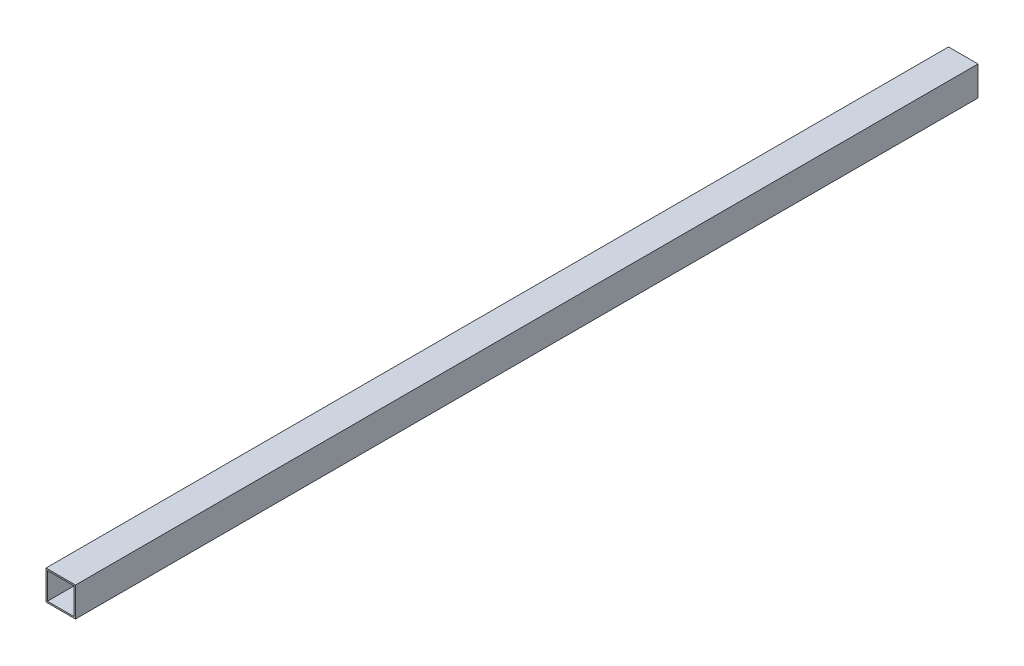
ISO-10303-21;
HEADER;
FILE_DESCRIPTION(('STEP AP214'),'2;1');
FILE_NAME('part.step','',(''),(''),'','','');
FILE_SCHEMA(('AUTOMOTIVE_DESIGN { 1 0 10303 214 1 1 1 1 }'));
ENDSEC;
DATA;
#1=APPLICATION_CONTEXT('core data for automotive mechanical design processes');
#2=APPLICATION_PROTOCOL_DEFINITION('international standard','automotive_design',2000,#1);
#3=PRODUCT_CONTEXT('',#1,'mechanical');
#4=PRODUCT('Part','Part','',(#3));
#5=PRODUCT_RELATED_PRODUCT_CATEGORY('part','',(#4));
#6=PRODUCT_DEFINITION_FORMATION('','',#4);
#7=PRODUCT_DEFINITION_CONTEXT('part definition',#1,'design');
#8=PRODUCT_DEFINITION('design','',#6,#7);
#9=PRODUCT_DEFINITION_SHAPE('','',#8);
#10=(LENGTH_UNIT() NAMED_UNIT(*) SI_UNIT(.MILLI.,.METRE.));
#11=(NAMED_UNIT(*) PLANE_ANGLE_UNIT() SI_UNIT($,.RADIAN.));
#12=(NAMED_UNIT(*) SI_UNIT($,.STERADIAN.) SOLID_ANGLE_UNIT());
#13=UNCERTAINTY_MEASURE_WITH_UNIT(LENGTH_MEASURE(1.E-05),#10,'distance_accuracy_value','');
#14=(GEOMETRIC_REPRESENTATION_CONTEXT(3) GLOBAL_UNCERTAINTY_ASSIGNED_CONTEXT((#13)) GLOBAL_UNIT_ASSIGNED_CONTEXT((#10,
#11,#12)) REPRESENTATION_CONTEXT('',''));
#15=CARTESIAN_POINT('',(0.,0.,0.));
#16=DIRECTION('',(0.,0.,1.));
#17=DIRECTION('',(1.,0.,0.));
#18=AXIS2_PLACEMENT_3D('',#15,#16,#17);
#19=CARTESIAN_POINT('',(0.,0.,765.));
#20=DIRECTION('',(0.,0.,-1.));
#21=DIRECTION('',(-1.,0.,0.));
#22=AXIS2_PLACEMENT_3D('',#19,#20,#21);
#23=PLANE('',#22);
#24=DIRECTION('',(0.,1.,0.));
#25=VECTOR('',#24,1.);
#26=CARTESIAN_POINT('',(12.5,-12.5,765.));
#27=LINE('',#26,#25);
#28=CARTESIAN_POINT('',(12.5,-12.5,765.));
#29=VERTEX_POINT('',#28);
#30=CARTESIAN_POINT('',(12.5,12.5,765.));
#31=VERTEX_POINT('',#30);
#32=EDGE_CURVE('E134',#29,#31,#27,.T.);
#33=ORIENTED_EDGE('',*,*,#32,.T.);
#34=DIRECTION('',(-1.,0.,0.));
#35=VECTOR('',#34,1.);
#36=CARTESIAN_POINT('',(-12.5,12.5,765.));
#37=LINE('',#36,#35);
#38=CARTESIAN_POINT('',(-12.5,12.5,765.));
#39=VERTEX_POINT('',#38);
#40=EDGE_CURVE('E137',#31,#39,#37,.T.);
#41=ORIENTED_EDGE('',*,*,#40,.T.);
#42=DIRECTION('',(0.,-1.,0.));
#43=VECTOR('',#42,1.);
#44=CARTESIAN_POINT('',(-12.5,-12.5,765.));
#45=LINE('',#44,#43);
#46=CARTESIAN_POINT('',(-12.5,-12.5,765.));
#47=VERTEX_POINT('',#46);
#48=EDGE_CURVE('E140',#39,#47,#45,.T.);
#49=ORIENTED_EDGE('',*,*,#48,.T.);
#50=DIRECTION('',(1.,0.,0.));
#51=VECTOR('',#50,1.);
#52=CARTESIAN_POINT('',(-12.5,-12.5,765.));
#53=LINE('',#52,#51);
#54=EDGE_CURVE('E142',#47,#29,#53,.T.);
#55=ORIENTED_EDGE('',*,*,#54,.T.);
#56=EDGE_LOOP('',(#33,#41,#49,#55));
#57=FACE_BOUND('',#56,.T.);
#58=DIRECTION('',(0.,-1.,0.));
#59=VECTOR('',#58,1.);
#60=CARTESIAN_POINT('',(-11.3,-11.3,765.));
#61=LINE('',#60,#59);
#62=CARTESIAN_POINT('',(-11.3,11.3,765.));
#63=VERTEX_POINT('',#62);
#64=CARTESIAN_POINT('',(-11.3,-11.3,765.));
#65=VERTEX_POINT('',#64);
#66=EDGE_CURVE('E98',#63,#65,#61,.T.);
#67=ORIENTED_EDGE('',*,*,#66,.F.);
#68=DIRECTION('',(-1.,0.,0.));
#69=VECTOR('',#68,1.);
#70=CARTESIAN_POINT('',(-11.3,11.3,765.));
#71=LINE('',#70,#69);
#72=CARTESIAN_POINT('',(11.3,11.3,765.));
#73=VERTEX_POINT('',#72);
#74=EDGE_CURVE('E120',#73,#63,#71,.T.);
#75=ORIENTED_EDGE('',*,*,#74,.F.);
#76=DIRECTION('',(0.,1.,0.));
#77=VECTOR('',#76,1.);
#78=CARTESIAN_POINT('',(11.3,-11.3,765.));
#79=LINE('',#78,#77);
#80=CARTESIAN_POINT('',(11.3,-11.3,765.));
#81=VERTEX_POINT('',#80);
#82=EDGE_CURVE('E118',#81,#73,#79,.T.);
#83=ORIENTED_EDGE('',*,*,#82,.F.);
#84=DIRECTION('',(1.,0.,0.));
#85=VECTOR('',#84,1.);
#86=CARTESIAN_POINT('',(-11.3,-11.3,765.));
#87=LINE('',#86,#85);
#88=EDGE_CURVE('E106',#65,#81,#87,.T.);
#89=ORIENTED_EDGE('',*,*,#88,.F.);
#90=EDGE_LOOP('',(#67,#75,#83,#89));
#91=FACE_BOUND('',#90,.T.);
#92=ADVANCED_FACE('F33',(#57,#91),#23,.F.);
#93=CARTESIAN_POINT('',(0.,0.,0.));
#94=DIRECTION('',(0.,0.,-1.));
#95=DIRECTION('',(-1.,0.,0.));
#96=AXIS2_PLACEMENT_3D('',#93,#94,#95);
#97=PLANE('',#96);
#98=DIRECTION('',(0.,1.,0.));
#99=VECTOR('',#98,1.);
#100=CARTESIAN_POINT('',(12.5,-12.5,0.));
#101=LINE('',#100,#99);
#102=CARTESIAN_POINT('',(12.5,-12.5,0.));
#103=VERTEX_POINT('',#102);
#104=CARTESIAN_POINT('',(12.5,12.5,0.));
#105=VERTEX_POINT('',#104);
#106=EDGE_CURVE('E114',#103,#105,#101,.T.);
#107=ORIENTED_EDGE('',*,*,#106,.F.);
#108=DIRECTION('',(1.,0.,0.));
#109=VECTOR('',#108,1.);
#110=CARTESIAN_POINT('',(-12.5,-12.5,0.));
#111=LINE('',#110,#109);
#112=CARTESIAN_POINT('',(-12.5,-12.5,0.));
#113=VERTEX_POINT('',#112);
#114=EDGE_CURVE('E138',#113,#103,#111,.T.);
#115=ORIENTED_EDGE('',*,*,#114,.F.);
#116=DIRECTION('',(0.,-1.,0.));
#117=VECTOR('',#116,1.);
#118=CARTESIAN_POINT('',(-12.5,-12.5,0.));
#119=LINE('',#118,#117);
#120=CARTESIAN_POINT('',(-12.5,12.5,0.));
#121=VERTEX_POINT('',#120);
#122=EDGE_CURVE('E149',#121,#113,#119,.T.);
#123=ORIENTED_EDGE('',*,*,#122,.F.);
#124=DIRECTION('',(-1.,0.,0.));
#125=VECTOR('',#124,1.);
#126=CARTESIAN_POINT('',(-12.5,12.5,0.));
#127=LINE('',#126,#125);
#128=EDGE_CURVE('E147',#105,#121,#127,.T.);
#129=ORIENTED_EDGE('',*,*,#128,.F.);
#130=EDGE_LOOP('',(#107,#115,#123,#129));
#131=FACE_BOUND('',#130,.T.);
#132=DIRECTION('',(-1.,0.,0.));
#133=VECTOR('',#132,1.);
#134=CARTESIAN_POINT('',(-11.3,11.3,0.));
#135=LINE('',#134,#133);
#136=CARTESIAN_POINT('',(11.3,11.3,0.));
#137=VERTEX_POINT('',#136);
#138=CARTESIAN_POINT('',(-11.3,11.3,0.));
#139=VERTEX_POINT('',#138);
#140=EDGE_CURVE('E107',#137,#139,#135,.T.);
#141=ORIENTED_EDGE('',*,*,#140,.T.);
#142=DIRECTION('',(0.,-1.,0.));
#143=VECTOR('',#142,1.);
#144=CARTESIAN_POINT('',(-11.3,-11.3,0.));
#145=LINE('',#144,#143);
#146=CARTESIAN_POINT('',(-11.3,-11.3,0.));
#147=VERTEX_POINT('',#146);
#148=EDGE_CURVE('E56',#139,#147,#145,.T.);
#149=ORIENTED_EDGE('',*,*,#148,.T.);
#150=DIRECTION('',(1.,0.,0.));
#151=VECTOR('',#150,1.);
#152=CARTESIAN_POINT('',(-11.3,-11.3,0.));
#153=LINE('',#152,#151);
#154=CARTESIAN_POINT('',(11.3,-11.3,0.));
#155=VERTEX_POINT('',#154);
#156=EDGE_CURVE('E113',#147,#155,#153,.T.);
#157=ORIENTED_EDGE('',*,*,#156,.T.);
#158=DIRECTION('',(0.,1.,0.));
#159=VECTOR('',#158,1.);
#160=CARTESIAN_POINT('',(11.3,-11.3,0.));
#161=LINE('',#160,#159);
#162=EDGE_CURVE('E126',#155,#137,#161,.T.);
#163=ORIENTED_EDGE('',*,*,#162,.T.);
#164=EDGE_LOOP('',(#141,#149,#157,#163));
#165=FACE_BOUND('',#164,.T.);
#166=ADVANCED_FACE('F167',(#131,#165),#97,.T.);
#167=CARTESIAN_POINT('',(12.5,-12.5,765.));
#168=DIRECTION('',(-1.,0.,0.));
#169=DIRECTION('',(0.,0.,1.));
#170=AXIS2_PLACEMENT_3D('',#167,#168,#169);
#171=PLANE('',#170);
#172=ORIENTED_EDGE('',*,*,#106,.T.);
#173=DIRECTION('',(0.,0.,-1.));
#174=VECTOR('',#173,1.);
#175=CARTESIAN_POINT('',(12.5,12.5,765.));
#176=LINE('',#175,#174);
#177=EDGE_CURVE('E11',#31,#105,#176,.T.);
#178=ORIENTED_EDGE('',*,*,#177,.F.);
#179=ORIENTED_EDGE('',*,*,#32,.F.);
#180=DIRECTION('',(0.,0.,-1.));
#181=VECTOR('',#180,1.);
#182=CARTESIAN_POINT('',(12.5,-12.5,765.));
#183=LINE('',#182,#181);
#184=EDGE_CURVE('E144',#29,#103,#183,.T.);
#185=ORIENTED_EDGE('',*,*,#184,.T.);
#186=EDGE_LOOP('',(#172,#178,#179,#185));
#187=FACE_BOUND('',#186,.T.);
#188=ADVANCED_FACE('F35',(#187),#171,.F.);
#189=CARTESIAN_POINT('',(-12.5,12.5,765.));
#190=DIRECTION('',(0.,-1.,0.));
#191=DIRECTION('',(0.,0.,-1.));
#192=AXIS2_PLACEMENT_3D('',#189,#190,#191);
#193=PLANE('',#192);
#194=ORIENTED_EDGE('',*,*,#128,.T.);
#195=DIRECTION('',(0.,0.,-1.));
#196=VECTOR('',#195,1.);
#197=CARTESIAN_POINT('',(-12.5,12.5,765.));
#198=LINE('',#197,#196);
#199=EDGE_CURVE('E41',#39,#121,#198,.T.);
#200=ORIENTED_EDGE('',*,*,#199,.F.);
#201=ORIENTED_EDGE('',*,*,#40,.F.);
#202=ORIENTED_EDGE('',*,*,#177,.T.);
#203=EDGE_LOOP('',(#194,#200,#201,#202));
#204=FACE_BOUND('',#203,.T.);
#205=ADVANCED_FACE('F177',(#204),#193,.F.);
#206=CARTESIAN_POINT('',(-12.5,-12.5,765.));
#207=DIRECTION('',(1.,0.,0.));
#208=DIRECTION('',(0.,0.,-1.));
#209=AXIS2_PLACEMENT_3D('',#206,#207,#208);
#210=PLANE('',#209);
#211=ORIENTED_EDGE('',*,*,#122,.T.);
#212=DIRECTION('',(0.,0.,-1.));
#213=VECTOR('',#212,1.);
#214=CARTESIAN_POINT('',(-12.5,-12.5,765.));
#215=LINE('',#214,#213);
#216=EDGE_CURVE('E154',#47,#113,#215,.T.);
#217=ORIENTED_EDGE('',*,*,#216,.F.);
#218=ORIENTED_EDGE('',*,*,#48,.F.);
#219=ORIENTED_EDGE('',*,*,#199,.T.);
#220=EDGE_LOOP('',(#211,#217,#218,#219));
#221=FACE_BOUND('',#220,.T.);
#222=ADVANCED_FACE('F161',(#221),#210,.F.);
#223=CARTESIAN_POINT('',(-12.5,-12.5,765.));
#224=DIRECTION('',(0.,1.,0.));
#225=DIRECTION('',(0.,0.,1.));
#226=AXIS2_PLACEMENT_3D('',#223,#224,#225);
#227=PLANE('',#226);
#228=ORIENTED_EDGE('',*,*,#114,.T.);
#229=ORIENTED_EDGE('',*,*,#184,.F.);
#230=ORIENTED_EDGE('',*,*,#54,.F.);
#231=ORIENTED_EDGE('',*,*,#216,.T.);
#232=EDGE_LOOP('',(#228,#229,#230,#231));
#233=FACE_BOUND('',#232,.T.);
#234=ADVANCED_FACE('F171',(#233),#227,.F.);
#235=CARTESIAN_POINT('',(-11.3,-11.3,765.));
#236=DIRECTION('',(1.,0.,0.));
#237=DIRECTION('',(0.,0.,-1.));
#238=AXIS2_PLACEMENT_3D('',#235,#236,#237);
#239=PLANE('',#238);
#240=ORIENTED_EDGE('',*,*,#148,.F.);
#241=DIRECTION('',(0.,0.,-1.));
#242=VECTOR('',#241,1.);
#243=CARTESIAN_POINT('',(-11.3,11.3,765.));
#244=LINE('',#243,#242);
#245=EDGE_CURVE('E102',#63,#139,#244,.T.);
#246=ORIENTED_EDGE('',*,*,#245,.F.);
#247=ORIENTED_EDGE('',*,*,#66,.T.);
#248=DIRECTION('',(0.,0.,-1.));
#249=VECTOR('',#248,1.);
#250=CARTESIAN_POINT('',(-11.3,-11.3,765.));
#251=LINE('',#250,#249);
#252=EDGE_CURVE('E101',#65,#147,#251,.T.);
#253=ORIENTED_EDGE('',*,*,#252,.T.);
#254=EDGE_LOOP('',(#240,#246,#247,#253));
#255=FACE_BOUND('',#254,.T.);
#256=ADVANCED_FACE('F100',(#255),#239,.T.);
#257=CARTESIAN_POINT('',(-11.3,-11.3,765.));
#258=DIRECTION('',(0.,1.,0.));
#259=DIRECTION('',(0.,0.,1.));
#260=AXIS2_PLACEMENT_3D('',#257,#258,#259);
#261=PLANE('',#260);
#262=ORIENTED_EDGE('',*,*,#156,.F.);
#263=ORIENTED_EDGE('',*,*,#252,.F.);
#264=ORIENTED_EDGE('',*,*,#88,.T.);
#265=DIRECTION('',(0.,0.,-1.));
#266=VECTOR('',#265,1.);
#267=CARTESIAN_POINT('',(11.3,-11.3,765.));
#268=LINE('',#267,#266);
#269=EDGE_CURVE('E115',#81,#155,#268,.T.);
#270=ORIENTED_EDGE('',*,*,#269,.T.);
#271=EDGE_LOOP('',(#262,#263,#264,#270));
#272=FACE_BOUND('',#271,.T.);
#273=ADVANCED_FACE('F110',(#272),#261,.T.);
#274=CARTESIAN_POINT('',(11.3,-11.3,765.));
#275=DIRECTION('',(-1.,0.,0.));
#276=DIRECTION('',(0.,0.,1.));
#277=AXIS2_PLACEMENT_3D('',#274,#275,#276);
#278=PLANE('',#277);
#279=ORIENTED_EDGE('',*,*,#162,.F.);
#280=ORIENTED_EDGE('',*,*,#269,.F.);
#281=ORIENTED_EDGE('',*,*,#82,.T.);
#282=DIRECTION('',(0.,0.,-1.));
#283=VECTOR('',#282,1.);
#284=CARTESIAN_POINT('',(11.3,11.3,765.));
#285=LINE('',#284,#283);
#286=EDGE_CURVE('E48',#73,#137,#285,.T.);
#287=ORIENTED_EDGE('',*,*,#286,.T.);
#288=EDGE_LOOP('',(#279,#280,#281,#287));
#289=FACE_BOUND('',#288,.T.);
#290=ADVANCED_FACE('F200',(#289),#278,.T.);
#291=CARTESIAN_POINT('',(-11.3,11.3,765.));
#292=DIRECTION('',(0.,-1.,0.));
#293=DIRECTION('',(0.,0.,-1.));
#294=AXIS2_PLACEMENT_3D('',#291,#292,#293);
#295=PLANE('',#294);
#296=ORIENTED_EDGE('',*,*,#140,.F.);
#297=ORIENTED_EDGE('',*,*,#286,.F.);
#298=ORIENTED_EDGE('',*,*,#74,.T.);
#299=ORIENTED_EDGE('',*,*,#245,.T.);
#300=EDGE_LOOP('',(#296,#297,#298,#299));
#301=FACE_BOUND('',#300,.T.);
#302=ADVANCED_FACE('F204',(#301),#295,.T.);
#303=CLOSED_SHELL('',(#92,#166,#188,#205,#222,#234,#256,#273,#290,#302));
#304=MANIFOLD_SOLID_BREP('B2',#303);
#305=ADVANCED_BREP_SHAPE_REPRESENTATION('',(#18,#304),#14);
#306=SHAPE_DEFINITION_REPRESENTATION(#9,#305);
ENDSEC;
END-ISO-10303-21;
